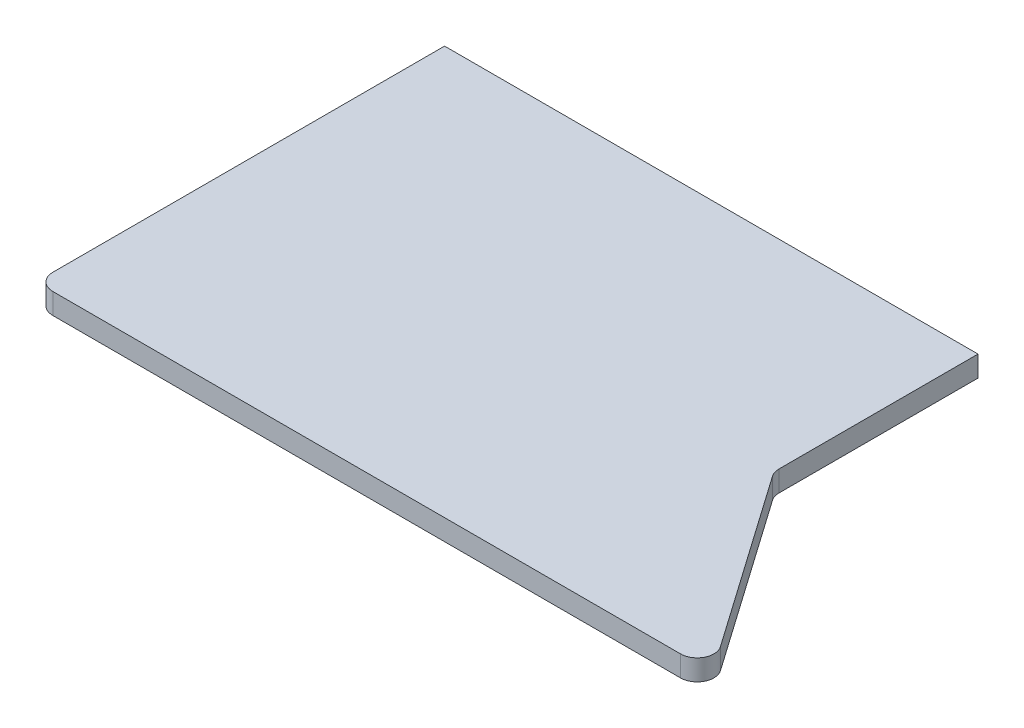
ISO-10303-21;
HEADER;
FILE_DESCRIPTION(('STEP AP214'),'2;1');
FILE_NAME('part.step','',(''),(''),'','','');
FILE_SCHEMA(('AUTOMOTIVE_DESIGN { 1 0 10303 214 1 1 1 1 }'));
ENDSEC;
DATA;
#1=APPLICATION_CONTEXT('core data for automotive mechanical design processes');
#2=APPLICATION_PROTOCOL_DEFINITION('international standard','automotive_design',2000,#1);
#3=PRODUCT_CONTEXT('',#1,'mechanical');
#4=PRODUCT('Part','Part','',(#3));
#5=PRODUCT_RELATED_PRODUCT_CATEGORY('part','',(#4));
#6=PRODUCT_DEFINITION_FORMATION('','',#4);
#7=PRODUCT_DEFINITION_CONTEXT('part definition',#1,'design');
#8=PRODUCT_DEFINITION('design','',#6,#7);
#9=PRODUCT_DEFINITION_SHAPE('','',#8);
#10=(LENGTH_UNIT() NAMED_UNIT(*) SI_UNIT(.MILLI.,.METRE.));
#11=(NAMED_UNIT(*) PLANE_ANGLE_UNIT() SI_UNIT($,.RADIAN.));
#12=(NAMED_UNIT(*) SI_UNIT($,.STERADIAN.) SOLID_ANGLE_UNIT());
#13=UNCERTAINTY_MEASURE_WITH_UNIT(LENGTH_MEASURE(1.E-05),#10,'distance_accuracy_value','');
#14=(GEOMETRIC_REPRESENTATION_CONTEXT(3) GLOBAL_UNCERTAINTY_ASSIGNED_CONTEXT((#13)) GLOBAL_UNIT_ASSIGNED_CONTEXT((#10,
#11,#12)) REPRESENTATION_CONTEXT('',''));
#15=CARTESIAN_POINT('',(0.,0.,0.));
#16=DIRECTION('',(0.,0.,1.));
#17=DIRECTION('',(1.,0.,0.));
#18=AXIS2_PLACEMENT_3D('',#15,#16,#17);
#19=CARTESIAN_POINT('',(0.,3.175,0.));
#20=DIRECTION('',(0.,0.,1.));
#21=DIRECTION('',(1.,0.,0.));
#22=AXIS2_PLACEMENT_3D('',#19,#20,#21);
#23=PLANE('',#22);
#24=DIRECTION('',(-1.,0.,0.));
#25=VECTOR('',#24,1.);
#26=CARTESIAN_POINT('',(0.,3.175,0.));
#27=LINE('',#26,#25);
#28=CARTESIAN_POINT('',(98.1876629488882,3.175,0.));
#29=VERTEX_POINT('',#28);
#30=CARTESIAN_POINT('',(2.54,3.175,0.));
#31=VERTEX_POINT('',#30);
#32=EDGE_CURVE('E160',#29,#31,#27,.T.);
#33=ORIENTED_EDGE('',*,*,#32,.T.);
#34=DIRECTION('',(0.,-1.,0.));
#35=VECTOR('',#34,1.);
#36=CARTESIAN_POINT('',(2.54,3.175,0.));
#37=LINE('',#36,#35);
#38=CARTESIAN_POINT('',(2.54,0.,0.));
#39=VERTEX_POINT('',#38);
#40=EDGE_CURVE('E175',#31,#39,#37,.T.);
#41=ORIENTED_EDGE('',*,*,#40,.T.);
#42=DIRECTION('',(-1.,0.,0.));
#43=VECTOR('',#42,1.);
#44=CARTESIAN_POINT('',(0.,0.,0.));
#45=LINE('',#44,#43);
#46=CARTESIAN_POINT('',(98.1876629488882,0.,0.));
#47=VERTEX_POINT('',#46);
#48=EDGE_CURVE('E145',#47,#39,#45,.T.);
#49=ORIENTED_EDGE('',*,*,#48,.F.);
#50=DIRECTION('',(0.,-1.,0.));
#51=VECTOR('',#50,1.);
#52=CARTESIAN_POINT('',(98.1876629488882,3.175,0.));
#53=LINE('',#52,#51);
#54=EDGE_CURVE('E172',#47,#29,#53,.F.);
#55=ORIENTED_EDGE('',*,*,#54,.T.);
#56=EDGE_LOOP('',(#33,#41,#49,#55));
#57=FACE_BOUND('',#56,.T.);
#58=ADVANCED_FACE('F45',(#57),#23,.T.);
#59=CARTESIAN_POINT('',(69.1589665726323,3.175,-48.4256297289499));
#60=DIRECTION('',(0.819152044288995,0.,-0.573576436351042));
#61=DIRECTION('',(-0.573576436351042,0.,-0.819152044288995));
#62=AXIS2_PLACEMENT_3D('',#59,#60,#61);
#63=PLANE('',#62);
#64=DIRECTION('',(0.573576436351042,0.,0.819152044288995));
#65=VECTOR('',#64,1.);
#66=CARTESIAN_POINT('',(69.1589665726323,0.,-48.4256297289499));
#67=LINE('',#66,#65);
#68=CARTESIAN_POINT('',(81.7393538075059,0.,-30.458974775421));
#69=VERTEX_POINT('',#68);
#70=CARTESIAN_POINT('',(100.268309141382,0.,-3.99688414833164));
#71=VERTEX_POINT('',#70);
#72=EDGE_CURVE('E148',#69,#71,#67,.T.);
#73=ORIENTED_EDGE('',*,*,#72,.F.);
#74=DIRECTION('',(0.,-1.,0.));
#75=VECTOR('',#74,1.);
#76=CARTESIAN_POINT('',(81.7393538075059,3.175,-30.458974775421));
#77=LINE('',#76,#75);
#78=CARTESIAN_POINT('',(81.7393538075059,3.175,-30.458974775421));
#79=VERTEX_POINT('',#78);
#80=EDGE_CURVE('E169',#69,#79,#77,.F.);
#81=ORIENTED_EDGE('',*,*,#80,.T.);
#82=DIRECTION('',(0.573576436351042,0.,0.819152044288995));
#83=VECTOR('',#82,1.);
#84=CARTESIAN_POINT('',(69.1589665726323,3.175,-48.4256297289499));
#85=LINE('',#84,#83);
#86=CARTESIAN_POINT('',(100.268309141382,3.175,-3.99688414833164));
#87=VERTEX_POINT('',#86);
#88=EDGE_CURVE('E121',#79,#87,#85,.T.);
#89=ORIENTED_EDGE('',*,*,#88,.T.);
#90=DIRECTION('',(0.,-1.,0.));
#91=VECTOR('',#90,1.);
#92=CARTESIAN_POINT('',(100.268309141382,3.175,-3.99688414833164));
#93=LINE('',#92,#91);
#94=EDGE_CURVE('E165',#87,#71,#93,.T.);
#95=ORIENTED_EDGE('',*,*,#94,.T.);
#96=EDGE_LOOP('',(#73,#81,#89,#95));
#97=FACE_BOUND('',#96,.T.);
#98=ADVANCED_FACE('F197',(#97),#63,.T.);
#99=CARTESIAN_POINT('',(81.28,3.175,0.));
#100=DIRECTION('',(-1.,0.,0.));
#101=DIRECTION('',(0.,0.,1.));
#102=AXIS2_PLACEMENT_3D('',#99,#100,#101);
#103=PLANE('',#102);
#104=DIRECTION('',(0.,0.,-1.));
#105=VECTOR('',#104,1.);
#106=CARTESIAN_POINT('',(81.28,3.175,0.));
#107=LINE('',#106,#105);
#108=CARTESIAN_POINT('',(81.28,3.175,-31.9158589237526));
#109=VERTEX_POINT('',#108);
#110=CARTESIAN_POINT('',(81.28,3.175,-62.23));
#111=VERTEX_POINT('',#110);
#112=EDGE_CURVE('E110',#109,#111,#107,.T.);
#113=ORIENTED_EDGE('',*,*,#112,.F.);
#114=DIRECTION('',(0.,-1.,0.));
#115=VECTOR('',#114,1.);
#116=CARTESIAN_POINT('',(81.28,3.175,-31.9158589237526));
#117=LINE('',#116,#115);
#118=CARTESIAN_POINT('',(81.28,0.,-31.9158589237526));
#119=VERTEX_POINT('',#118);
#120=EDGE_CURVE('E132',#109,#119,#117,.T.);
#121=ORIENTED_EDGE('',*,*,#120,.T.);
#122=DIRECTION('',(0.,0.,-1.));
#123=VECTOR('',#122,1.);
#124=CARTESIAN_POINT('',(81.28,0.,0.));
#125=LINE('',#124,#123);
#126=CARTESIAN_POINT('',(81.28,0.,-62.23));
#127=VERTEX_POINT('',#126);
#128=EDGE_CURVE('E127',#119,#127,#125,.T.);
#129=ORIENTED_EDGE('',*,*,#128,.T.);
#130=DIRECTION('',(0.,-1.,0.));
#131=VECTOR('',#130,1.);
#132=CARTESIAN_POINT('',(81.28,3.175,-62.23));
#133=LINE('',#132,#131);
#134=EDGE_CURVE('E124',#111,#127,#133,.T.);
#135=ORIENTED_EDGE('',*,*,#134,.F.);
#136=EDGE_LOOP('',(#113,#121,#129,#135));
#137=FACE_BOUND('',#136,.T.);
#138=ADVANCED_FACE('F125',(#137),#103,.F.);
#139=CARTESIAN_POINT('',(0.,3.175,-62.23));
#140=DIRECTION('',(0.,0.,-1.));
#141=DIRECTION('',(-1.,0.,0.));
#142=AXIS2_PLACEMENT_3D('',#139,#140,#141);
#143=PLANE('',#142);
#144=DIRECTION('',(1.,0.,0.));
#145=VECTOR('',#144,1.);
#146=CARTESIAN_POINT('',(0.,0.,-62.23));
#147=LINE('',#146,#145);
#148=CARTESIAN_POINT('',(0.,0.,-62.23));
#149=VERTEX_POINT('',#148);
#150=EDGE_CURVE('E154',#149,#127,#147,.T.);
#151=ORIENTED_EDGE('',*,*,#150,.F.);
#152=DIRECTION('',(0.,-1.,0.));
#153=VECTOR('',#152,1.);
#154=CARTESIAN_POINT('',(0.,3.175,-62.23));
#155=LINE('',#154,#153);
#156=CARTESIAN_POINT('',(0.,3.175,-62.23));
#157=VERTEX_POINT('',#156);
#158=EDGE_CURVE('E133',#157,#149,#155,.T.);
#159=ORIENTED_EDGE('',*,*,#158,.F.);
#160=DIRECTION('',(1.,0.,0.));
#161=VECTOR('',#160,1.);
#162=CARTESIAN_POINT('',(0.,3.175,-62.23));
#163=LINE('',#162,#161);
#164=EDGE_CURVE('E114',#157,#111,#163,.T.);
#165=ORIENTED_EDGE('',*,*,#164,.T.);
#166=ORIENTED_EDGE('',*,*,#134,.T.);
#167=EDGE_LOOP('',(#151,#159,#165,#166));
#168=FACE_BOUND('',#167,.T.);
#169=ADVANCED_FACE('F136',(#168),#143,.T.);
#170=CARTESIAN_POINT('',(0.,3.175,0.));
#171=DIRECTION('',(-1.,0.,0.));
#172=DIRECTION('',(0.,0.,1.));
#173=AXIS2_PLACEMENT_3D('',#170,#171,#172);
#174=PLANE('',#173);
#175=DIRECTION('',(0.,0.,-1.));
#176=VECTOR('',#175,1.);
#177=CARTESIAN_POINT('',(0.,0.,0.));
#178=LINE('',#177,#176);
#179=CARTESIAN_POINT('',(0.,0.,-2.54));
#180=VERTEX_POINT('',#179);
#181=EDGE_CURVE('E157',#180,#149,#178,.T.);
#182=ORIENTED_EDGE('',*,*,#181,.F.);
#183=DIRECTION('',(0.,-1.,0.));
#184=VECTOR('',#183,1.);
#185=CARTESIAN_POINT('',(0.,3.175,-2.54));
#186=LINE('',#185,#184);
#187=CARTESIAN_POINT('',(0.,3.175,-2.54));
#188=VERTEX_POINT('',#187);
#189=EDGE_CURVE('E61',#180,#188,#186,.F.);
#190=ORIENTED_EDGE('',*,*,#189,.T.);
#191=DIRECTION('',(0.,0.,-1.));
#192=VECTOR('',#191,1.);
#193=CARTESIAN_POINT('',(0.,3.175,0.));
#194=LINE('',#193,#192);
#195=EDGE_CURVE('E139',#188,#157,#194,.T.);
#196=ORIENTED_EDGE('',*,*,#195,.T.);
#197=ORIENTED_EDGE('',*,*,#158,.T.);
#198=EDGE_LOOP('',(#182,#190,#196,#197));
#199=FACE_BOUND('',#198,.T.);
#200=ADVANCED_FACE('F223',(#199),#174,.T.);
#201=CARTESIAN_POINT('',(0.,3.175,0.));
#202=DIRECTION('',(0.,1.,0.));
#203=DIRECTION('',(0.,0.,1.));
#204=AXIS2_PLACEMENT_3D('',#201,#202,#203);
#205=PLANE('',#204);
#206=ORIENTED_EDGE('',*,*,#195,.F.);
#207=CARTESIAN_POINT('',(2.54,3.175,-2.54));
#208=DIRECTION('',(0.,1.,0.));
#209=DIRECTION('',(0.,0.,1.));
#210=AXIS2_PLACEMENT_3D('',#207,#208,#209);
#211=CIRCLE('',#210,2.54);
#212=EDGE_CURVE('E189',#188,#31,#211,.T.);
#213=ORIENTED_EDGE('',*,*,#212,.T.);
#214=ORIENTED_EDGE('',*,*,#32,.F.);
#215=CARTESIAN_POINT('',(98.1876629488882,3.175,-2.54));
#216=DIRECTION('',(0.,1.,0.));
#217=DIRECTION('',(0.,0.,1.));
#218=AXIS2_PLACEMENT_3D('',#215,#216,#217);
#219=CIRCLE('',#218,2.54);
#220=EDGE_CURVE('E186',#29,#87,#219,.T.);
#221=ORIENTED_EDGE('',*,*,#220,.T.);
#222=ORIENTED_EDGE('',*,*,#88,.F.);
#223=CARTESIAN_POINT('',(83.82,3.175,-31.9158589237526));
#224=DIRECTION('',(0.,1.,0.));
#225=DIRECTION('',(0.,0.,1.));
#226=AXIS2_PLACEMENT_3D('',#223,#224,#225);
#227=CIRCLE('',#226,2.54);
#228=EDGE_CURVE('E11',#79,#109,#227,.F.);
#229=ORIENTED_EDGE('',*,*,#228,.T.);
#230=ORIENTED_EDGE('',*,*,#112,.T.);
#231=ORIENTED_EDGE('',*,*,#164,.F.);
#232=EDGE_LOOP('',(#206,#213,#214,#221,#222,#229,#230,#231));
#233=FACE_BOUND('',#232,.T.);
#234=ADVANCED_FACE('F112',(#233),#205,.T.);
#235=CARTESIAN_POINT('',(0.,0.,0.));
#236=DIRECTION('',(0.,1.,0.));
#237=DIRECTION('',(0.,0.,1.));
#238=AXIS2_PLACEMENT_3D('',#235,#236,#237);
#239=PLANE('',#238);
#240=ORIENTED_EDGE('',*,*,#48,.T.);
#241=CARTESIAN_POINT('',(2.54,0.,-2.54));
#242=DIRECTION('',(0.,1.,0.));
#243=DIRECTION('',(0.,0.,1.));
#244=AXIS2_PLACEMENT_3D('',#241,#242,#243);
#245=CIRCLE('',#244,2.54);
#246=EDGE_CURVE('E69',#39,#180,#245,.F.);
#247=ORIENTED_EDGE('',*,*,#246,.T.);
#248=ORIENTED_EDGE('',*,*,#181,.T.);
#249=ORIENTED_EDGE('',*,*,#150,.T.);
#250=ORIENTED_EDGE('',*,*,#128,.F.);
#251=CARTESIAN_POINT('',(83.82,0.,-31.9158589237526));
#252=DIRECTION('',(0.,1.,0.));
#253=DIRECTION('',(0.,0.,1.));
#254=AXIS2_PLACEMENT_3D('',#251,#252,#253);
#255=CIRCLE('',#254,2.54);
#256=EDGE_CURVE('E54',#119,#69,#255,.T.);
#257=ORIENTED_EDGE('',*,*,#256,.T.);
#258=ORIENTED_EDGE('',*,*,#72,.T.);
#259=CARTESIAN_POINT('',(98.1876629488882,0.,-2.54));
#260=DIRECTION('',(0.,1.,0.));
#261=DIRECTION('',(0.,0.,1.));
#262=AXIS2_PLACEMENT_3D('',#259,#260,#261);
#263=CIRCLE('',#262,2.54);
#264=EDGE_CURVE('E179',#71,#47,#263,.F.);
#265=ORIENTED_EDGE('',*,*,#264,.T.);
#266=EDGE_LOOP('',(#240,#247,#248,#249,#250,#257,#258,#265));
#267=FACE_BOUND('',#266,.T.);
#268=ADVANCED_FACE('F193',(#267),#239,.F.);
#269=CARTESIAN_POINT('',(83.82,3.175,-31.9158589237526));
#270=DIRECTION('',(0.,-1.,0.));
#271=DIRECTION('',(0.,0.,-1.));
#272=AXIS2_PLACEMENT_3D('',#269,#270,#271);
#273=CYLINDRICAL_SURFACE('',#272,2.54);
#274=ORIENTED_EDGE('',*,*,#228,.F.);
#275=ORIENTED_EDGE('',*,*,#80,.F.);
#276=ORIENTED_EDGE('',*,*,#256,.F.);
#277=ORIENTED_EDGE('',*,*,#120,.F.);
#278=EDGE_LOOP('',(#274,#275,#276,#277));
#279=FACE_BOUND('',#278,.T.);
#280=ADVANCED_FACE('F200',(#279),#273,.F.);
#281=CARTESIAN_POINT('',(2.54,3.175,-2.54));
#282=DIRECTION('',(0.,-1.,0.));
#283=DIRECTION('',(0.,0.,-1.));
#284=AXIS2_PLACEMENT_3D('',#281,#282,#283);
#285=CYLINDRICAL_SURFACE('',#284,2.54);
#286=ORIENTED_EDGE('',*,*,#212,.F.);
#287=ORIENTED_EDGE('',*,*,#189,.F.);
#288=ORIENTED_EDGE('',*,*,#246,.F.);
#289=ORIENTED_EDGE('',*,*,#40,.F.);
#290=EDGE_LOOP('',(#286,#287,#288,#289));
#291=FACE_BOUND('',#290,.T.);
#292=ADVANCED_FACE('F202',(#291),#285,.T.);
#293=CARTESIAN_POINT('',(98.1876629488882,3.175,-2.54));
#294=DIRECTION('',(0.,-1.,0.));
#295=DIRECTION('',(0.,0.,-1.));
#296=AXIS2_PLACEMENT_3D('',#293,#294,#295);
#297=CYLINDRICAL_SURFACE('',#296,2.54);
#298=ORIENTED_EDGE('',*,*,#220,.F.);
#299=ORIENTED_EDGE('',*,*,#54,.F.);
#300=ORIENTED_EDGE('',*,*,#264,.F.);
#301=ORIENTED_EDGE('',*,*,#94,.F.);
#302=EDGE_LOOP('',(#298,#299,#300,#301));
#303=FACE_BOUND('',#302,.T.);
#304=ADVANCED_FACE('F47',(#303),#297,.T.);
#305=CLOSED_SHELL('',(#58,#98,#138,#169,#200,#234,#268,#280,#292,#304));
#306=MANIFOLD_SOLID_BREP('B2',#305);
#307=ADVANCED_BREP_SHAPE_REPRESENTATION('',(#18,#306),#14);
#308=SHAPE_DEFINITION_REPRESENTATION(#9,#307);
ENDSEC;
END-ISO-10303-21;
